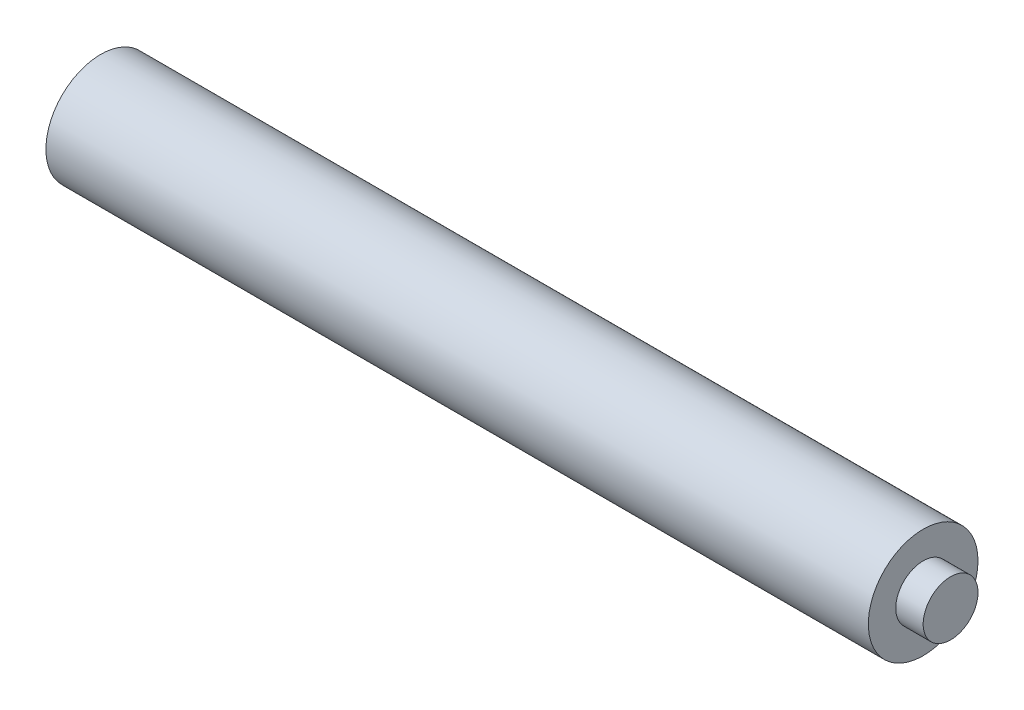
ISO-10303-21;
HEADER;
FILE_DESCRIPTION(('STEP AP214'),'2;1');
FILE_NAME('part.step','',(''),(''),'','','');
FILE_SCHEMA(('AUTOMOTIVE_DESIGN { 1 0 10303 214 1 1 1 1 }'));
ENDSEC;
DATA;
#1=APPLICATION_CONTEXT('core data for automotive mechanical design processes');
#2=APPLICATION_PROTOCOL_DEFINITION('international standard','automotive_design',2000,#1);
#3=PRODUCT_CONTEXT('',#1,'mechanical');
#4=PRODUCT('Part','Part','',(#3));
#5=PRODUCT_RELATED_PRODUCT_CATEGORY('part','',(#4));
#6=PRODUCT_DEFINITION_FORMATION('','',#4);
#7=PRODUCT_DEFINITION_CONTEXT('part definition',#1,'design');
#8=PRODUCT_DEFINITION('design','',#6,#7);
#9=PRODUCT_DEFINITION_SHAPE('','',#8);
#10=(LENGTH_UNIT() NAMED_UNIT(*) SI_UNIT(.MILLI.,.METRE.));
#11=(NAMED_UNIT(*) PLANE_ANGLE_UNIT() SI_UNIT($,.RADIAN.));
#12=(NAMED_UNIT(*) SI_UNIT($,.STERADIAN.) SOLID_ANGLE_UNIT());
#13=UNCERTAINTY_MEASURE_WITH_UNIT(LENGTH_MEASURE(1.E-05),#10,'distance_accuracy_value','');
#14=(GEOMETRIC_REPRESENTATION_CONTEXT(3) GLOBAL_UNCERTAINTY_ASSIGNED_CONTEXT((#13)) GLOBAL_UNIT_ASSIGNED_CONTEXT((#10,
#11,#12)) REPRESENTATION_CONTEXT('',''));
#15=CARTESIAN_POINT('',(0.,0.,0.));
#16=DIRECTION('',(0.,0.,1.));
#17=DIRECTION('',(1.,0.,0.));
#18=AXIS2_PLACEMENT_3D('',#15,#16,#17);
#19=CARTESIAN_POINT('',(30.,0.,0.));
#20=DIRECTION('',(-1.,0.,0.));
#21=DIRECTION('',(0.,0.,1.));
#22=AXIS2_PLACEMENT_3D('',#19,#20,#21);
#23=CYLINDRICAL_SURFACE('',#22,4.);
#24=CARTESIAN_POINT('',(30.,0.,0.));
#25=DIRECTION('',(1.,0.,0.));
#26=DIRECTION('',(0.,0.,-1.));
#27=AXIS2_PLACEMENT_3D('',#24,#25,#26);
#28=CIRCLE('',#27,4.);
#29=CARTESIAN_POINT('',(30.,0.,-4.));
#30=VERTEX_POINT('',#29);
#31=EDGE_CURVE('E55',#30,#30,#28,.T.);
#32=ORIENTED_EDGE('',*,*,#31,.F.);
#33=EDGE_LOOP('',(#32));
#34=FACE_BOUND('',#33,.T.);
#35=CARTESIAN_POINT('',(-30.,0.,0.));
#36=DIRECTION('',(1.,0.,0.));
#37=DIRECTION('',(0.,0.,-1.));
#38=AXIS2_PLACEMENT_3D('',#35,#36,#37);
#39=CIRCLE('',#38,4.);
#40=CARTESIAN_POINT('',(-30.,0.,-4.));
#41=VERTEX_POINT('',#40);
#42=EDGE_CURVE('E50',#41,#41,#39,.T.);
#43=ORIENTED_EDGE('',*,*,#42,.T.);
#44=EDGE_LOOP('',(#43));
#45=FACE_BOUND('',#44,.T.);
#46=ADVANCED_FACE('F47',(#34,#45),#23,.T.);
#47=CARTESIAN_POINT('',(30.,0.,0.));
#48=DIRECTION('',(1.,0.,0.));
#49=DIRECTION('',(0.,0.,-1.));
#50=AXIS2_PLACEMENT_3D('',#47,#48,#49);
#51=PLANE('',#50);
#52=CARTESIAN_POINT('',(30.,0.,0.));
#53=DIRECTION('',(1.,0.,0.));
#54=DIRECTION('',(0.,0.,-1.));
#55=AXIS2_PLACEMENT_3D('',#52,#53,#54);
#56=CIRCLE('',#55,2.);
#57=CARTESIAN_POINT('',(30.,0.,-2.));
#58=VERTEX_POINT('',#57);
#59=EDGE_CURVE('E10',#58,#58,#56,.T.);
#60=ORIENTED_EDGE('',*,*,#59,.F.);
#61=EDGE_LOOP('',(#60));
#62=FACE_BOUND('',#61,.T.);
#63=ORIENTED_EDGE('',*,*,#31,.T.);
#64=EDGE_LOOP('',(#63));
#65=FACE_BOUND('',#64,.T.);
#66=ADVANCED_FACE('F75',(#62,#65),#51,.T.);
#67=CARTESIAN_POINT('',(-30.,0.,0.));
#68=DIRECTION('',(1.,0.,0.));
#69=DIRECTION('',(0.,0.,-1.));
#70=AXIS2_PLACEMENT_3D('',#67,#68,#69);
#71=PLANE('',#70);
#72=ORIENTED_EDGE('',*,*,#42,.F.);
#73=EDGE_LOOP('',(#72));
#74=FACE_BOUND('',#73,.T.);
#75=ADVANCED_FACE('F72',(#74),#71,.F.);
#76=CARTESIAN_POINT('',(32.,0.,0.));
#77=DIRECTION('',(-1.,0.,0.));
#78=DIRECTION('',(0.,0.,1.));
#79=AXIS2_PLACEMENT_3D('',#76,#77,#78);
#80=CYLINDRICAL_SURFACE('',#79,2.);
#81=CARTESIAN_POINT('',(32.,0.,0.));
#82=DIRECTION('',(1.,0.,0.));
#83=DIRECTION('',(0.,0.,-1.));
#84=AXIS2_PLACEMENT_3D('',#81,#82,#83);
#85=CIRCLE('',#84,2.);
#86=CARTESIAN_POINT('',(32.,0.,-2.));
#87=VERTEX_POINT('',#86);
#88=EDGE_CURVE('E62',#87,#87,#85,.T.);
#89=ORIENTED_EDGE('',*,*,#88,.F.);
#90=EDGE_LOOP('',(#89));
#91=FACE_BOUND('',#90,.T.);
#92=ORIENTED_EDGE('',*,*,#59,.T.);
#93=EDGE_LOOP('',(#92));
#94=FACE_BOUND('',#93,.T.);
#95=ADVANCED_FACE('F74',(#91,#94),#80,.T.);
#96=CARTESIAN_POINT('',(32.,0.,0.));
#97=DIRECTION('',(1.,0.,0.));
#98=DIRECTION('',(0.,0.,-1.));
#99=AXIS2_PLACEMENT_3D('',#96,#97,#98);
#100=PLANE('',#99);
#101=ORIENTED_EDGE('',*,*,#88,.T.);
#102=EDGE_LOOP('',(#101));
#103=FACE_BOUND('',#102,.T.);
#104=ADVANCED_FACE('F80',(#103),#100,.T.);
#105=CLOSED_SHELL('',(#46,#66,#75,#95,#104));
#106=MANIFOLD_SOLID_BREP('B2',#105);
#107=ADVANCED_BREP_SHAPE_REPRESENTATION('',(#18,#106),#14);
#108=SHAPE_DEFINITION_REPRESENTATION(#9,#107);
ENDSEC;
END-ISO-10303-21;
